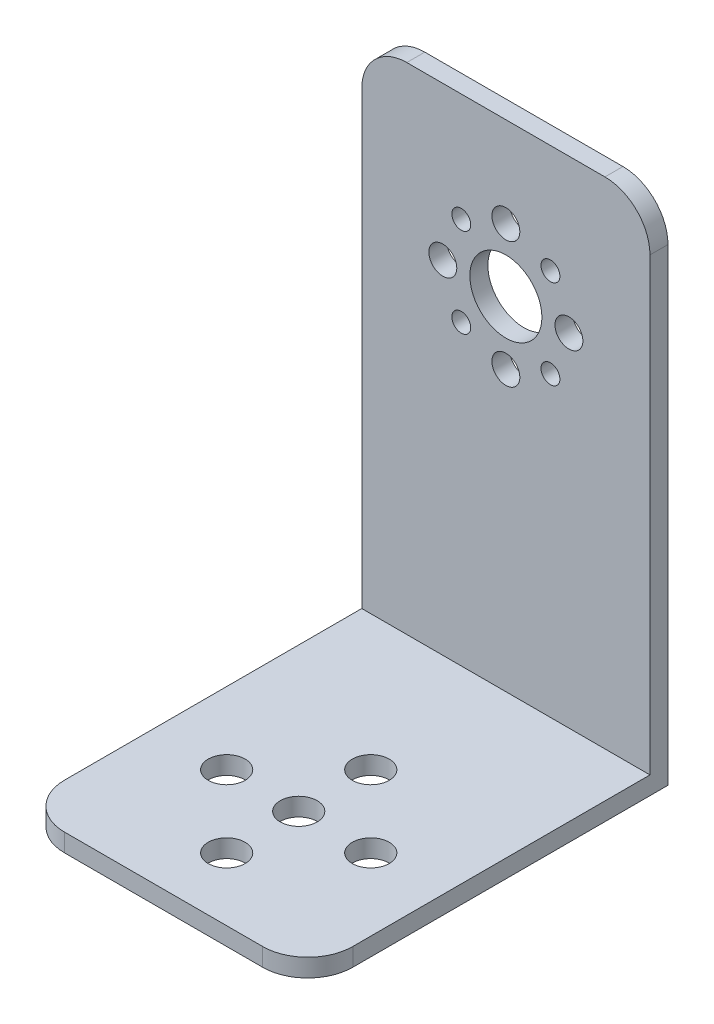
ISO-10303-21;
HEADER;
FILE_DESCRIPTION(('STEP AP214'),'2;1');
FILE_NAME('part.step','',(''),(''),'','','');
FILE_SCHEMA(('AUTOMOTIVE_DESIGN { 1 0 10303 214 1 1 1 1 }'));
ENDSEC;
DATA;
#1=APPLICATION_CONTEXT('core data for automotive mechanical design processes');
#2=APPLICATION_PROTOCOL_DEFINITION('international standard','automotive_design',2000,#1);
#3=PRODUCT_CONTEXT('',#1,'mechanical');
#4=PRODUCT('Part','Part','',(#3));
#5=PRODUCT_RELATED_PRODUCT_CATEGORY('part','',(#4));
#6=PRODUCT_DEFINITION_FORMATION('','',#4);
#7=PRODUCT_DEFINITION_CONTEXT('part definition',#1,'design');
#8=PRODUCT_DEFINITION('design','',#6,#7);
#9=PRODUCT_DEFINITION_SHAPE('','',#8);
#10=(LENGTH_UNIT() NAMED_UNIT(*) SI_UNIT(.MILLI.,.METRE.));
#11=(NAMED_UNIT(*) PLANE_ANGLE_UNIT() SI_UNIT($,.RADIAN.));
#12=(NAMED_UNIT(*) SI_UNIT($,.STERADIAN.) SOLID_ANGLE_UNIT());
#13=UNCERTAINTY_MEASURE_WITH_UNIT(LENGTH_MEASURE(1.E-05),#10,'distance_accuracy_value','');
#14=(GEOMETRIC_REPRESENTATION_CONTEXT(3) GLOBAL_UNCERTAINTY_ASSIGNED_CONTEXT((#13)) GLOBAL_UNIT_ASSIGNED_CONTEXT((#10,
#11,#12)) REPRESENTATION_CONTEXT('',''));
#15=CARTESIAN_POINT('',(0.,0.,0.));
#16=DIRECTION('',(0.,0.,1.));
#17=DIRECTION('',(1.,0.,0.));
#18=AXIS2_PLACEMENT_3D('',#15,#16,#17);
#19=CARTESIAN_POINT('',(16.,2.,-20.));
#20=DIRECTION('',(-1.,0.,0.));
#21=DIRECTION('',(0.,0.,1.));
#22=AXIS2_PLACEMENT_3D('',#19,#20,#21);
#23=PLANE('',#22);
#24=DIRECTION('',(0.,-1.,0.));
#25=VECTOR('',#24,1.);
#26=CARTESIAN_POINT('',(16.,2.,-20.));
#27=LINE('',#26,#25);
#28=CARTESIAN_POINT('',(16.,52.,-20.));
#29=VERTEX_POINT('',#28);
#30=CARTESIAN_POINT('',(16.,0.,-20.));
#31=VERTEX_POINT('',#30);
#32=EDGE_CURVE('E161',#29,#31,#27,.T.);
#33=ORIENTED_EDGE('',*,*,#32,.F.);
#34=DIRECTION('',(0.,0.,-1.));
#35=VECTOR('',#34,1.);
#36=CARTESIAN_POINT('',(16.,52.,-18.));
#37=LINE('',#36,#35);
#38=CARTESIAN_POINT('',(16.,52.,-18.));
#39=VERTEX_POINT('',#38);
#40=EDGE_CURVE('E128',#29,#39,#37,.F.);
#41=ORIENTED_EDGE('',*,*,#40,.T.);
#42=DIRECTION('',(0.,-1.,0.));
#43=VECTOR('',#42,1.);
#44=CARTESIAN_POINT('',(16.,57.,-18.));
#45=LINE('',#44,#43);
#46=CARTESIAN_POINT('',(16.,2.,-18.));
#47=VERTEX_POINT('',#46);
#48=EDGE_CURVE('E125',#39,#47,#45,.T.);
#49=ORIENTED_EDGE('',*,*,#48,.T.);
#50=DIRECTION('',(0.,0.,-1.));
#51=VECTOR('',#50,1.);
#52=CARTESIAN_POINT('',(16.,2.,-20.));
#53=LINE('',#52,#51);
#54=CARTESIAN_POINT('',(16.,2.,15.));
#55=VERTEX_POINT('',#54);
#56=EDGE_CURVE('E111',#55,#47,#53,.T.);
#57=ORIENTED_EDGE('',*,*,#56,.F.);
#58=DIRECTION('',(0.,-1.,0.));
#59=VECTOR('',#58,1.);
#60=CARTESIAN_POINT('',(16.,2.,15.));
#61=LINE('',#60,#59);
#62=CARTESIAN_POINT('',(16.,0.,15.));
#63=VERTEX_POINT('',#62);
#64=EDGE_CURVE('E174',#55,#63,#61,.T.);
#65=ORIENTED_EDGE('',*,*,#64,.T.);
#66=DIRECTION('',(0.,0.,-1.));
#67=VECTOR('',#66,1.);
#68=CARTESIAN_POINT('',(16.,0.,-20.));
#69=LINE('',#68,#67);
#70=EDGE_CURVE('E146',#63,#31,#69,.T.);
#71=ORIENTED_EDGE('',*,*,#70,.T.);
#72=EDGE_LOOP('',(#33,#41,#49,#57,#65,#71));
#73=FACE_BOUND('',#72,.T.);
#74=ADVANCED_FACE('F35',(#73),#23,.F.);
#75=CARTESIAN_POINT('',(-16.,2.,-20.));
#76=DIRECTION('',(0.,0.,1.));
#77=DIRECTION('',(1.,0.,0.));
#78=AXIS2_PLACEMENT_3D('',#75,#76,#77);
#79=PLANE('',#78);
#80=CARTESIAN_POINT('',(0.,47.,-20.));
#81=DIRECTION('',(0.,0.,1.));
#82=DIRECTION('',(1.,0.,0.));
#83=AXIS2_PLACEMENT_3D('',#80,#81,#82);
#84=CIRCLE('',#83,1.55);
#85=CARTESIAN_POINT('',(1.55,47.,-20.));
#86=VERTEX_POINT('',#85);
#87=EDGE_CURVE('E333',#86,#86,#84,.T.);
#88=ORIENTED_EDGE('',*,*,#87,.T.);
#89=EDGE_LOOP('',(#88));
#90=FACE_BOUND('',#89,.T.);
#91=CARTESIAN_POINT('',(4.94974746830584,44.9497474683058,-20.));
#92=DIRECTION('',(0.,0.,1.));
#93=DIRECTION('',(1.,0.,0.));
#94=AXIS2_PLACEMENT_3D('',#91,#92,#93);
#95=CIRCLE('',#94,1.05);
#96=CARTESIAN_POINT('',(5.99974746830584,44.9497474683058,-20.));
#97=VERTEX_POINT('',#96);
#98=EDGE_CURVE('E330',#97,#97,#95,.T.);
#99=ORIENTED_EDGE('',*,*,#98,.T.);
#100=EDGE_LOOP('',(#99));
#101=FACE_BOUND('',#100,.T.);
#102=CARTESIAN_POINT('',(7.,40.,-20.));
#103=DIRECTION('',(0.,0.,1.));
#104=DIRECTION('',(1.,0.,0.));
#105=AXIS2_PLACEMENT_3D('',#102,#103,#104);
#106=CIRCLE('',#105,1.55);
#107=CARTESIAN_POINT('',(8.55,40.,-20.));
#108=VERTEX_POINT('',#107);
#109=EDGE_CURVE('E321',#108,#108,#106,.T.);
#110=ORIENTED_EDGE('',*,*,#109,.T.);
#111=EDGE_LOOP('',(#110));
#112=FACE_BOUND('',#111,.T.);
#113=CARTESIAN_POINT('',(4.94974746830584,35.0502525316942,-20.));
#114=DIRECTION('',(0.,0.,1.));
#115=DIRECTION('',(1.,0.,0.));
#116=AXIS2_PLACEMENT_3D('',#113,#114,#115);
#117=CIRCLE('',#116,1.05);
#118=CARTESIAN_POINT('',(5.99974746830584,35.0502525316942,-20.));
#119=VERTEX_POINT('',#118);
#120=EDGE_CURVE('E317',#119,#119,#117,.T.);
#121=ORIENTED_EDGE('',*,*,#120,.T.);
#122=EDGE_LOOP('',(#121));
#123=FACE_BOUND('',#122,.T.);
#124=CARTESIAN_POINT('',(0.,33.,-20.));
#125=DIRECTION('',(0.,0.,1.));
#126=DIRECTION('',(1.,0.,0.));
#127=AXIS2_PLACEMENT_3D('',#124,#125,#126);
#128=CIRCLE('',#127,1.55);
#129=CARTESIAN_POINT('',(1.55,33.,-20.));
#130=VERTEX_POINT('',#129);
#131=EDGE_CURVE('E315',#130,#130,#128,.T.);
#132=ORIENTED_EDGE('',*,*,#131,.T.);
#133=EDGE_LOOP('',(#132));
#134=FACE_BOUND('',#133,.T.);
#135=CARTESIAN_POINT('',(-4.94974746830584,35.0502525316942,-20.));
#136=DIRECTION('',(0.,0.,1.));
#137=DIRECTION('',(1.,0.,0.));
#138=AXIS2_PLACEMENT_3D('',#135,#136,#137);
#139=CIRCLE('',#138,1.05);
#140=CARTESIAN_POINT('',(-3.89974746830584,35.0502525316942,-20.));
#141=VERTEX_POINT('',#140);
#142=EDGE_CURVE('E318',#141,#141,#139,.T.);
#143=ORIENTED_EDGE('',*,*,#142,.T.);
#144=EDGE_LOOP('',(#143));
#145=FACE_BOUND('',#144,.T.);
#146=CARTESIAN_POINT('',(-4.94974746830584,44.9497474683058,-20.));
#147=DIRECTION('',(0.,0.,1.));
#148=DIRECTION('',(1.,0.,0.));
#149=AXIS2_PLACEMENT_3D('',#146,#147,#148);
#150=CIRCLE('',#149,1.05);
#151=CARTESIAN_POINT('',(-3.89974746830584,44.9497474683058,-20.));
#152=VERTEX_POINT('',#151);
#153=EDGE_CURVE('E324',#152,#152,#150,.T.);
#154=ORIENTED_EDGE('',*,*,#153,.T.);
#155=EDGE_LOOP('',(#154));
#156=FACE_BOUND('',#155,.T.);
#157=CARTESIAN_POINT('',(-7.,40.,-20.));
#158=DIRECTION('',(0.,0.,1.));
#159=DIRECTION('',(1.,0.,0.));
#160=AXIS2_PLACEMENT_3D('',#157,#158,#159);
#161=CIRCLE('',#160,1.55);
#162=CARTESIAN_POINT('',(-5.45,40.,-20.));
#163=VERTEX_POINT('',#162);
#164=EDGE_CURVE('E401',#163,#163,#161,.T.);
#165=ORIENTED_EDGE('',*,*,#164,.T.);
#166=EDGE_LOOP('',(#165));
#167=FACE_BOUND('',#166,.T.);
#168=CARTESIAN_POINT('',(0.,40.,-20.));
#169=DIRECTION('',(0.,0.,1.));
#170=DIRECTION('',(1.,0.,0.));
#171=AXIS2_PLACEMENT_3D('',#168,#169,#170);
#172=CIRCLE('',#171,4.);
#173=CARTESIAN_POINT('',(4.,40.,-20.));
#174=VERTEX_POINT('',#173);
#175=EDGE_CURVE('E404',#174,#174,#172,.T.);
#176=ORIENTED_EDGE('',*,*,#175,.T.);
#177=EDGE_LOOP('',(#176));
#178=FACE_BOUND('',#177,.T.);
#179=DIRECTION('',(-1.,0.,0.));
#180=VECTOR('',#179,1.);
#181=CARTESIAN_POINT('',(16.,57.,-20.));
#182=LINE('',#181,#180);
#183=CARTESIAN_POINT('',(11.,57.,-20.));
#184=VERTEX_POINT('',#183);
#185=CARTESIAN_POINT('',(-11.,57.,-20.));
#186=VERTEX_POINT('',#185);
#187=EDGE_CURVE('E132',#184,#186,#182,.T.);
#188=ORIENTED_EDGE('',*,*,#187,.F.);
#189=CARTESIAN_POINT('',(11.,52.,-20.));
#190=DIRECTION('',(0.,0.,1.));
#191=DIRECTION('',(1.,0.,0.));
#192=AXIS2_PLACEMENT_3D('',#189,#190,#191);
#193=CIRCLE('',#192,5.);
#194=EDGE_CURVE('E172',#184,#29,#193,.F.);
#195=ORIENTED_EDGE('',*,*,#194,.T.);
#196=ORIENTED_EDGE('',*,*,#32,.T.);
#197=DIRECTION('',(-1.,0.,0.));
#198=VECTOR('',#197,1.);
#199=CARTESIAN_POINT('',(-16.,0.,-20.));
#200=LINE('',#199,#198);
#201=CARTESIAN_POINT('',(-16.,0.,-20.));
#202=VERTEX_POINT('',#201);
#203=EDGE_CURVE('E153',#31,#202,#200,.T.);
#204=ORIENTED_EDGE('',*,*,#203,.T.);
#205=DIRECTION('',(0.,-1.,0.));
#206=VECTOR('',#205,1.);
#207=CARTESIAN_POINT('',(-16.,2.,-20.));
#208=LINE('',#207,#206);
#209=CARTESIAN_POINT('',(-16.,52.,-20.));
#210=VERTEX_POINT('',#209);
#211=EDGE_CURVE('E151',#210,#202,#208,.T.);
#212=ORIENTED_EDGE('',*,*,#211,.F.);
#213=CARTESIAN_POINT('',(-11.,52.,-20.));
#214=DIRECTION('',(0.,0.,1.));
#215=DIRECTION('',(1.,0.,0.));
#216=AXIS2_PLACEMENT_3D('',#213,#214,#215);
#217=CIRCLE('',#216,5.);
#218=EDGE_CURVE('E170',#210,#186,#217,.F.);
#219=ORIENTED_EDGE('',*,*,#218,.T.);
#220=EDGE_LOOP('',(#188,#195,#196,#204,#212,#219));
#221=FACE_BOUND('',#220,.T.);
#222=ADVANCED_FACE('F209',(#90,#101,#112,#123,#134,#145,#156,#167,#178,#221),#79,.F.);
#223=CARTESIAN_POINT('',(-16.,2.,-20.));
#224=DIRECTION('',(1.,0.,0.));
#225=DIRECTION('',(0.,0.,-1.));
#226=AXIS2_PLACEMENT_3D('',#223,#224,#225);
#227=PLANE('',#226);
#228=DIRECTION('',(0.,-1.,0.));
#229=VECTOR('',#228,1.);
#230=CARTESIAN_POINT('',(-16.,57.,-18.));
#231=LINE('',#230,#229);
#232=CARTESIAN_POINT('',(-16.,52.,-18.));
#233=VERTEX_POINT('',#232);
#234=CARTESIAN_POINT('',(-16.,2.,-18.));
#235=VERTEX_POINT('',#234);
#236=EDGE_CURVE('E131',#233,#235,#231,.T.);
#237=ORIENTED_EDGE('',*,*,#236,.F.);
#238=DIRECTION('',(0.,0.,1.));
#239=VECTOR('',#238,1.);
#240=CARTESIAN_POINT('',(-16.,52.,-20.));
#241=LINE('',#240,#239);
#242=EDGE_CURVE('E183',#233,#210,#241,.F.);
#243=ORIENTED_EDGE('',*,*,#242,.T.);
#244=ORIENTED_EDGE('',*,*,#211,.T.);
#245=DIRECTION('',(0.,0.,1.));
#246=VECTOR('',#245,1.);
#247=CARTESIAN_POINT('',(-16.,0.,-20.));
#248=LINE('',#247,#246);
#249=CARTESIAN_POINT('',(-16.,0.,15.));
#250=VERTEX_POINT('',#249);
#251=EDGE_CURVE('E156',#202,#250,#248,.T.);
#252=ORIENTED_EDGE('',*,*,#251,.T.);
#253=DIRECTION('',(0.,-1.,0.));
#254=VECTOR('',#253,1.);
#255=CARTESIAN_POINT('',(-16.,2.,15.));
#256=LINE('',#255,#254);
#257=CARTESIAN_POINT('',(-16.,2.,15.));
#258=VERTEX_POINT('',#257);
#259=EDGE_CURVE('E181',#250,#258,#256,.F.);
#260=ORIENTED_EDGE('',*,*,#259,.T.);
#261=DIRECTION('',(0.,0.,1.));
#262=VECTOR('',#261,1.);
#263=CARTESIAN_POINT('',(-16.,2.,-20.));
#264=LINE('',#263,#262);
#265=EDGE_CURVE('E121',#235,#258,#264,.T.);
#266=ORIENTED_EDGE('',*,*,#265,.F.);
#267=EDGE_LOOP('',(#237,#243,#244,#252,#260,#266));
#268=FACE_BOUND('',#267,.T.);
#269=ADVANCED_FACE('F201',(#268),#227,.F.);
#270=CARTESIAN_POINT('',(-16.,2.,20.));
#271=DIRECTION('',(0.,0.,-1.));
#272=DIRECTION('',(-1.,0.,0.));
#273=AXIS2_PLACEMENT_3D('',#270,#271,#272);
#274=PLANE('',#273);
#275=DIRECTION('',(1.,0.,0.));
#276=VECTOR('',#275,1.);
#277=CARTESIAN_POINT('',(-16.,2.,20.));
#278=LINE('',#277,#276);
#279=CARTESIAN_POINT('',(-11.,2.,20.));
#280=VERTEX_POINT('',#279);
#281=CARTESIAN_POINT('',(11.,2.,20.));
#282=VERTEX_POINT('',#281);
#283=EDGE_CURVE('E149',#280,#282,#278,.T.);
#284=ORIENTED_EDGE('',*,*,#283,.F.);
#285=DIRECTION('',(0.,-1.,0.));
#286=VECTOR('',#285,1.);
#287=CARTESIAN_POINT('',(-11.,2.,20.));
#288=LINE('',#287,#286);
#289=CARTESIAN_POINT('',(-11.,0.,20.));
#290=VERTEX_POINT('',#289);
#291=EDGE_CURVE('E186',#280,#290,#288,.T.);
#292=ORIENTED_EDGE('',*,*,#291,.T.);
#293=DIRECTION('',(1.,0.,0.));
#294=VECTOR('',#293,1.);
#295=CARTESIAN_POINT('',(-16.,0.,20.));
#296=LINE('',#295,#294);
#297=CARTESIAN_POINT('',(11.,0.,20.));
#298=VERTEX_POINT('',#297);
#299=EDGE_CURVE('E122',#290,#298,#296,.T.);
#300=ORIENTED_EDGE('',*,*,#299,.T.);
#301=DIRECTION('',(0.,-1.,0.));
#302=VECTOR('',#301,1.);
#303=CARTESIAN_POINT('',(11.,2.,20.));
#304=LINE('',#303,#302);
#305=EDGE_CURVE('E50',#298,#282,#304,.F.);
#306=ORIENTED_EDGE('',*,*,#305,.T.);
#307=EDGE_LOOP('',(#284,#292,#300,#306));
#308=FACE_BOUND('',#307,.T.);
#309=ADVANCED_FACE('F204',(#308),#274,.F.);
#310=CARTESIAN_POINT('',(0.,2.,0.));
#311=DIRECTION('',(0.,1.,0.));
#312=DIRECTION('',(0.,0.,1.));
#313=AXIS2_PLACEMENT_3D('',#310,#311,#312);
#314=PLANE('',#313);
#315=CARTESIAN_POINT('',(-8.,2.,5.00000000000001));
#316=DIRECTION('',(0.,1.,0.));
#317=DIRECTION('',(0.,0.,1.));
#318=AXIS2_PLACEMENT_3D('',#315,#316,#317);
#319=CIRCLE('',#318,2.05);
#320=CARTESIAN_POINT('',(-8.,2.,7.05000000000001));
#321=VERTEX_POINT('',#320);
#322=EDGE_CURVE('E352',#321,#321,#319,.T.);
#323=ORIENTED_EDGE('',*,*,#322,.F.);
#324=EDGE_LOOP('',(#323));
#325=FACE_BOUND('',#324,.T.);
#326=CARTESIAN_POINT('',(8.,2.,5.00000000000001));
#327=DIRECTION('',(0.,1.,0.));
#328=DIRECTION('',(0.,0.,1.));
#329=AXIS2_PLACEMENT_3D('',#326,#327,#328);
#330=CIRCLE('',#329,2.05);
#331=CARTESIAN_POINT('',(8.,2.,7.05000000000001));
#332=VERTEX_POINT('',#331);
#333=EDGE_CURVE('E340',#332,#332,#330,.T.);
#334=ORIENTED_EDGE('',*,*,#333,.F.);
#335=EDGE_LOOP('',(#334));
#336=FACE_BOUND('',#335,.T.);
#337=CARTESIAN_POINT('',(0.,2.,-2.99999999999999));
#338=DIRECTION('',(0.,1.,0.));
#339=DIRECTION('',(0.,0.,1.));
#340=AXIS2_PLACEMENT_3D('',#337,#338,#339);
#341=CIRCLE('',#340,2.05);
#342=CARTESIAN_POINT('',(0.,2.,-0.949999999999992));
#343=VERTEX_POINT('',#342);
#344=EDGE_CURVE('E341',#343,#343,#341,.T.);
#345=ORIENTED_EDGE('',*,*,#344,.F.);
#346=EDGE_LOOP('',(#345));
#347=FACE_BOUND('',#346,.T.);
#348=CARTESIAN_POINT('',(0.,2.,13.));
#349=DIRECTION('',(0.,1.,0.));
#350=DIRECTION('',(0.,0.,1.));
#351=AXIS2_PLACEMENT_3D('',#348,#349,#350);
#352=CIRCLE('',#351,2.05);
#353=CARTESIAN_POINT('',(0.,2.,15.05));
#354=VERTEX_POINT('',#353);
#355=EDGE_CURVE('E336',#354,#354,#352,.T.);
#356=ORIENTED_EDGE('',*,*,#355,.F.);
#357=EDGE_LOOP('',(#356));
#358=FACE_BOUND('',#357,.T.);
#359=CARTESIAN_POINT('',(0.,2.,5.00000000000001));
#360=DIRECTION('',(0.,1.,0.));
#361=DIRECTION('',(0.,0.,1.));
#362=AXIS2_PLACEMENT_3D('',#359,#360,#361);
#363=CIRCLE('',#362,2.05);
#364=CARTESIAN_POINT('',(0.,2.,7.05000000000001));
#365=VERTEX_POINT('',#364);
#366=EDGE_CURVE('E142',#365,#365,#363,.T.);
#367=ORIENTED_EDGE('',*,*,#366,.F.);
#368=EDGE_LOOP('',(#367));
#369=FACE_BOUND('',#368,.T.);
#370=ORIENTED_EDGE('',*,*,#265,.T.);
#371=CARTESIAN_POINT('',(-11.,2.,15.));
#372=DIRECTION('',(0.,1.,0.));
#373=DIRECTION('',(0.,0.,1.));
#374=AXIS2_PLACEMENT_3D('',#371,#372,#373);
#375=CIRCLE('',#374,5.);
#376=EDGE_CURVE('E11',#258,#280,#375,.T.);
#377=ORIENTED_EDGE('',*,*,#376,.T.);
#378=ORIENTED_EDGE('',*,*,#283,.T.);
#379=CARTESIAN_POINT('',(11.,2.,15.));
#380=DIRECTION('',(0.,1.,0.));
#381=DIRECTION('',(0.,0.,1.));
#382=AXIS2_PLACEMENT_3D('',#379,#380,#381);
#383=CIRCLE('',#382,5.);
#384=EDGE_CURVE('E43',#282,#55,#383,.T.);
#385=ORIENTED_EDGE('',*,*,#384,.T.);
#386=ORIENTED_EDGE('',*,*,#56,.T.);
#387=DIRECTION('',(1.,0.,0.));
#388=VECTOR('',#387,1.);
#389=CARTESIAN_POINT('',(-16.,2.,-18.));
#390=LINE('',#389,#388);
#391=EDGE_CURVE('E115',#235,#47,#390,.T.);
#392=ORIENTED_EDGE('',*,*,#391,.F.);
#393=EDGE_LOOP('',(#370,#377,#378,#385,#386,#392));
#394=FACE_BOUND('',#393,.T.);
#395=ADVANCED_FACE('F113',(#325,#336,#347,#358,#369,#394),#314,.T.);
#396=CARTESIAN_POINT('',(0.,0.,0.));
#397=DIRECTION('',(0.,1.,0.));
#398=DIRECTION('',(0.,0.,1.));
#399=AXIS2_PLACEMENT_3D('',#396,#397,#398);
#400=PLANE('',#399);
#401=CARTESIAN_POINT('',(-8.,0.,5.00000000000001));
#402=DIRECTION('',(0.,1.,0.));
#403=DIRECTION('',(0.,0.,1.));
#404=AXIS2_PLACEMENT_3D('',#401,#402,#403);
#405=CIRCLE('',#404,2.05);
#406=CARTESIAN_POINT('',(-8.,0.,7.05000000000001));
#407=VERTEX_POINT('',#406);
#408=EDGE_CURVE('E349',#407,#407,#405,.T.);
#409=ORIENTED_EDGE('',*,*,#408,.T.);
#410=EDGE_LOOP('',(#409));
#411=FACE_BOUND('',#410,.T.);
#412=CARTESIAN_POINT('',(8.,0.,5.00000000000001));
#413=DIRECTION('',(0.,1.,0.));
#414=DIRECTION('',(0.,0.,1.));
#415=AXIS2_PLACEMENT_3D('',#412,#413,#414);
#416=CIRCLE('',#415,2.05);
#417=CARTESIAN_POINT('',(8.,0.,7.05000000000001));
#418=VERTEX_POINT('',#417);
#419=EDGE_CURVE('E355',#418,#418,#416,.T.);
#420=ORIENTED_EDGE('',*,*,#419,.T.);
#421=EDGE_LOOP('',(#420));
#422=FACE_BOUND('',#421,.T.);
#423=CARTESIAN_POINT('',(0.,0.,-2.99999999999999));
#424=DIRECTION('',(0.,1.,0.));
#425=DIRECTION('',(0.,0.,1.));
#426=AXIS2_PLACEMENT_3D('',#423,#424,#425);
#427=CIRCLE('',#426,2.05);
#428=CARTESIAN_POINT('',(0.,0.,-0.949999999999992));
#429=VERTEX_POINT('',#428);
#430=EDGE_CURVE('E337',#429,#429,#427,.T.);
#431=ORIENTED_EDGE('',*,*,#430,.T.);
#432=EDGE_LOOP('',(#431));
#433=FACE_BOUND('',#432,.T.);
#434=CARTESIAN_POINT('',(0.,0.,13.));
#435=DIRECTION('',(0.,1.,0.));
#436=DIRECTION('',(0.,0.,1.));
#437=AXIS2_PLACEMENT_3D('',#434,#435,#436);
#438=CIRCLE('',#437,2.05);
#439=CARTESIAN_POINT('',(0.,0.,15.05));
#440=VERTEX_POINT('',#439);
#441=EDGE_CURVE('E344',#440,#440,#438,.T.);
#442=ORIENTED_EDGE('',*,*,#441,.T.);
#443=EDGE_LOOP('',(#442));
#444=FACE_BOUND('',#443,.T.);
#445=CARTESIAN_POINT('',(0.,0.,5.00000000000001));
#446=DIRECTION('',(0.,1.,0.));
#447=DIRECTION('',(0.,0.,1.));
#448=AXIS2_PLACEMENT_3D('',#445,#446,#447);
#449=CIRCLE('',#448,2.05);
#450=CARTESIAN_POINT('',(0.,0.,7.05000000000001));
#451=VERTEX_POINT('',#450);
#452=EDGE_CURVE('E137',#451,#451,#449,.T.);
#453=ORIENTED_EDGE('',*,*,#452,.T.);
#454=EDGE_LOOP('',(#453));
#455=FACE_BOUND('',#454,.T.);
#456=ORIENTED_EDGE('',*,*,#299,.F.);
#457=CARTESIAN_POINT('',(-11.,0.,15.));
#458=DIRECTION('',(0.,1.,0.));
#459=DIRECTION('',(0.,0.,1.));
#460=AXIS2_PLACEMENT_3D('',#457,#458,#459);
#461=CIRCLE('',#460,5.);
#462=EDGE_CURVE('E191',#290,#250,#461,.F.);
#463=ORIENTED_EDGE('',*,*,#462,.T.);
#464=ORIENTED_EDGE('',*,*,#251,.F.);
#465=ORIENTED_EDGE('',*,*,#203,.F.);
#466=ORIENTED_EDGE('',*,*,#70,.F.);
#467=CARTESIAN_POINT('',(11.,0.,15.));
#468=DIRECTION('',(0.,1.,0.));
#469=DIRECTION('',(0.,0.,1.));
#470=AXIS2_PLACEMENT_3D('',#467,#468,#469);
#471=CIRCLE('',#470,5.);
#472=EDGE_CURVE('E189',#63,#298,#471,.F.);
#473=ORIENTED_EDGE('',*,*,#472,.T.);
#474=EDGE_LOOP('',(#456,#463,#464,#465,#466,#473));
#475=FACE_BOUND('',#474,.T.);
#476=ADVANCED_FACE('F195',(#411,#422,#433,#444,#455,#475),#400,.F.);
#477=CARTESIAN_POINT('',(-16.,57.,-18.));
#478=DIRECTION('',(0.,0.,-1.));
#479=DIRECTION('',(-1.,0.,0.));
#480=AXIS2_PLACEMENT_3D('',#477,#478,#479);
#481=PLANE('',#480);
#482=CARTESIAN_POINT('',(0.,47.,-18.));
#483=DIRECTION('',(0.,0.,1.));
#484=DIRECTION('',(1.,0.,0.));
#485=AXIS2_PLACEMENT_3D('',#482,#483,#484);
#486=CIRCLE('',#485,1.55);
#487=CARTESIAN_POINT('',(1.55,47.,-18.));
#488=VERTEX_POINT('',#487);
#489=EDGE_CURVE('E410',#488,#488,#486,.T.);
#490=ORIENTED_EDGE('',*,*,#489,.F.);
#491=EDGE_LOOP('',(#490));
#492=FACE_BOUND('',#491,.T.);
#493=CARTESIAN_POINT('',(4.94974746830584,44.9497474683058,-18.));
#494=DIRECTION('',(0.,0.,1.));
#495=DIRECTION('',(1.,0.,0.));
#496=AXIS2_PLACEMENT_3D('',#493,#494,#495);
#497=CIRCLE('',#496,1.05);
#498=CARTESIAN_POINT('',(5.99974746830584,44.9497474683058,-18.));
#499=VERTEX_POINT('',#498);
#500=EDGE_CURVE('E419',#499,#499,#497,.T.);
#501=ORIENTED_EDGE('',*,*,#500,.F.);
#502=EDGE_LOOP('',(#501));
#503=FACE_BOUND('',#502,.T.);
#504=CARTESIAN_POINT('',(7.,40.,-18.));
#505=DIRECTION('',(0.,0.,1.));
#506=DIRECTION('',(-1.,0.,0.));
#507=AXIS2_PLACEMENT_3D('',#504,#505,#506);
#508=CIRCLE('',#507,1.55);
#509=CARTESIAN_POINT('',(5.44999999999999,40.,-18.));
#510=VERTEX_POINT('',#509);
#511=EDGE_CURVE('E416',#510,#510,#508,.T.);
#512=ORIENTED_EDGE('',*,*,#511,.F.);
#513=EDGE_LOOP('',(#512));
#514=FACE_BOUND('',#513,.T.);
#515=CARTESIAN_POINT('',(4.94974746830584,35.0502525316942,-18.));
#516=DIRECTION('',(0.,0.,1.));
#517=DIRECTION('',(-1.,0.,0.));
#518=AXIS2_PLACEMENT_3D('',#515,#516,#517);
#519=CIRCLE('',#518,1.05);
#520=CARTESIAN_POINT('',(3.89974746830584,35.0502525316942,-18.));
#521=VERTEX_POINT('',#520);
#522=EDGE_CURVE('E413',#521,#521,#519,.T.);
#523=ORIENTED_EDGE('',*,*,#522,.F.);
#524=EDGE_LOOP('',(#523));
#525=FACE_BOUND('',#524,.T.);
#526=CARTESIAN_POINT('',(0.,33.,-18.));
#527=DIRECTION('',(0.,0.,1.));
#528=DIRECTION('',(-1.,0.,0.));
#529=AXIS2_PLACEMENT_3D('',#526,#527,#528);
#530=CIRCLE('',#529,1.55);
#531=CARTESIAN_POINT('',(-1.55,33.,-18.));
#532=VERTEX_POINT('',#531);
#533=EDGE_CURVE('E312',#532,#532,#530,.T.);
#534=ORIENTED_EDGE('',*,*,#533,.F.);
#535=EDGE_LOOP('',(#534));
#536=FACE_BOUND('',#535,.T.);
#537=CARTESIAN_POINT('',(-4.94974746830584,35.0502525316942,-18.));
#538=DIRECTION('',(0.,0.,1.));
#539=DIRECTION('',(1.,0.,0.));
#540=AXIS2_PLACEMENT_3D('',#537,#538,#539);
#541=CIRCLE('',#540,1.05);
#542=CARTESIAN_POINT('',(-3.89974746830584,35.0502525316942,-18.));
#543=VERTEX_POINT('',#542);
#544=EDGE_CURVE('E430',#543,#543,#541,.T.);
#545=ORIENTED_EDGE('',*,*,#544,.F.);
#546=EDGE_LOOP('',(#545));
#547=FACE_BOUND('',#546,.T.);
#548=CARTESIAN_POINT('',(-4.94974746830584,44.9497474683058,-18.));
#549=DIRECTION('',(0.,0.,1.));
#550=DIRECTION('',(-1.,0.,0.));
#551=AXIS2_PLACEMENT_3D('',#548,#549,#550);
#552=CIRCLE('',#551,1.05);
#553=CARTESIAN_POINT('',(-5.99974746830584,44.9497474683058,-18.));
#554=VERTEX_POINT('',#553);
#555=EDGE_CURVE('E427',#554,#554,#552,.T.);
#556=ORIENTED_EDGE('',*,*,#555,.F.);
#557=EDGE_LOOP('',(#556));
#558=FACE_BOUND('',#557,.T.);
#559=CARTESIAN_POINT('',(-7.,40.,-18.));
#560=DIRECTION('',(0.,0.,1.));
#561=DIRECTION('',(1.,0.,0.));
#562=AXIS2_PLACEMENT_3D('',#559,#560,#561);
#563=CIRCLE('',#562,1.55);
#564=CARTESIAN_POINT('',(-5.45,40.,-18.));
#565=VERTEX_POINT('',#564);
#566=EDGE_CURVE('E424',#565,#565,#563,.T.);
#567=ORIENTED_EDGE('',*,*,#566,.F.);
#568=EDGE_LOOP('',(#567));
#569=FACE_BOUND('',#568,.T.);
#570=CARTESIAN_POINT('',(0.,40.,-18.));
#571=DIRECTION('',(0.,0.,1.));
#572=DIRECTION('',(1.,0.,0.));
#573=AXIS2_PLACEMENT_3D('',#570,#571,#572);
#574=CIRCLE('',#573,4.);
#575=CARTESIAN_POINT('',(4.,40.,-18.));
#576=VERTEX_POINT('',#575);
#577=EDGE_CURVE('E406',#576,#576,#574,.T.);
#578=ORIENTED_EDGE('',*,*,#577,.F.);
#579=EDGE_LOOP('',(#578));
#580=FACE_BOUND('',#579,.T.);
#581=ORIENTED_EDGE('',*,*,#48,.F.);
#582=CARTESIAN_POINT('',(11.,52.,-18.));
#583=DIRECTION('',(0.,0.,-1.));
#584=DIRECTION('',(-1.,0.,0.));
#585=AXIS2_PLACEMENT_3D('',#582,#583,#584);
#586=CIRCLE('',#585,5.);
#587=CARTESIAN_POINT('',(11.,57.,-18.));
#588=VERTEX_POINT('',#587);
#589=EDGE_CURVE('E179',#39,#588,#586,.F.);
#590=ORIENTED_EDGE('',*,*,#589,.T.);
#591=DIRECTION('',(1.,0.,0.));
#592=VECTOR('',#591,1.);
#593=CARTESIAN_POINT('',(-16.,57.,-18.));
#594=LINE('',#593,#592);
#595=CARTESIAN_POINT('',(-11.,57.,-18.));
#596=VERTEX_POINT('',#595);
#597=EDGE_CURVE('E136',#596,#588,#594,.T.);
#598=ORIENTED_EDGE('',*,*,#597,.F.);
#599=CARTESIAN_POINT('',(-11.,52.,-18.));
#600=DIRECTION('',(0.,0.,-1.));
#601=DIRECTION('',(-1.,0.,0.));
#602=AXIS2_PLACEMENT_3D('',#599,#600,#601);
#603=CIRCLE('',#602,5.);
#604=EDGE_CURVE('E177',#596,#233,#603,.F.);
#605=ORIENTED_EDGE('',*,*,#604,.T.);
#606=ORIENTED_EDGE('',*,*,#236,.T.);
#607=ORIENTED_EDGE('',*,*,#391,.T.);
#608=EDGE_LOOP('',(#581,#590,#598,#605,#606,#607));
#609=FACE_BOUND('',#608,.T.);
#610=ADVANCED_FACE('F134',(#492,#503,#514,#525,#536,#547,#558,#569,#580,#609),#481,.F.);
#611=CARTESIAN_POINT('',(0.,57.,0.));
#612=DIRECTION('',(0.,1.,0.));
#613=DIRECTION('',(0.,0.,1.));
#614=AXIS2_PLACEMENT_3D('',#611,#612,#613);
#615=PLANE('',#614);
#616=ORIENTED_EDGE('',*,*,#597,.T.);
#617=DIRECTION('',(0.,0.,-1.));
#618=VECTOR('',#617,1.);
#619=CARTESIAN_POINT('',(11.,57.,-20.));
#620=LINE('',#619,#618);
#621=EDGE_CURVE('E167',#588,#184,#620,.T.);
#622=ORIENTED_EDGE('',*,*,#621,.T.);
#623=ORIENTED_EDGE('',*,*,#187,.T.);
#624=DIRECTION('',(0.,0.,1.));
#625=VECTOR('',#624,1.);
#626=CARTESIAN_POINT('',(-11.,57.,-18.));
#627=LINE('',#626,#625);
#628=EDGE_CURVE('E164',#186,#596,#627,.T.);
#629=ORIENTED_EDGE('',*,*,#628,.T.);
#630=EDGE_LOOP('',(#616,#622,#623,#629));
#631=FACE_BOUND('',#630,.T.);
#632=ADVANCED_FACE('F216',(#631),#615,.T.);
#633=CARTESIAN_POINT('',(0.,0.,5.00000000000001));
#634=DIRECTION('',(0.,1.,0.));
#635=DIRECTION('',(0.,0.,1.));
#636=AXIS2_PLACEMENT_3D('',#633,#634,#635);
#637=CYLINDRICAL_SURFACE('',#636,2.05);
#638=ORIENTED_EDGE('',*,*,#452,.F.);
#639=EDGE_LOOP('',(#638));
#640=FACE_BOUND('',#639,.T.);
#641=ORIENTED_EDGE('',*,*,#366,.T.);
#642=EDGE_LOOP('',(#641));
#643=FACE_BOUND('',#642,.T.);
#644=ADVANCED_FACE('F253',(#640,#643),#637,.F.);
#645=CARTESIAN_POINT('',(0.,0.,13.));
#646=DIRECTION('',(0.,1.,0.));
#647=DIRECTION('',(0.,0.,1.));
#648=AXIS2_PLACEMENT_3D('',#645,#646,#647);
#649=CYLINDRICAL_SURFACE('',#648,2.05);
#650=ORIENTED_EDGE('',*,*,#441,.F.);
#651=EDGE_LOOP('',(#650));
#652=FACE_BOUND('',#651,.T.);
#653=ORIENTED_EDGE('',*,*,#355,.T.);
#654=EDGE_LOOP('',(#653));
#655=FACE_BOUND('',#654,.T.);
#656=ADVANCED_FACE('F256',(#652,#655),#649,.F.);
#657=CARTESIAN_POINT('',(0.,0.,-2.99999999999999));
#658=DIRECTION('',(0.,1.,0.));
#659=DIRECTION('',(0.,0.,1.));
#660=AXIS2_PLACEMENT_3D('',#657,#658,#659);
#661=CYLINDRICAL_SURFACE('',#660,2.05);
#662=ORIENTED_EDGE('',*,*,#430,.F.);
#663=EDGE_LOOP('',(#662));
#664=FACE_BOUND('',#663,.T.);
#665=ORIENTED_EDGE('',*,*,#344,.T.);
#666=EDGE_LOOP('',(#665));
#667=FACE_BOUND('',#666,.T.);
#668=ADVANCED_FACE('F261',(#664,#667),#661,.F.);
#669=CARTESIAN_POINT('',(8.,0.,5.00000000000001));
#670=DIRECTION('',(0.,1.,0.));
#671=DIRECTION('',(0.,0.,1.));
#672=AXIS2_PLACEMENT_3D('',#669,#670,#671);
#673=CYLINDRICAL_SURFACE('',#672,2.05);
#674=ORIENTED_EDGE('',*,*,#419,.F.);
#675=EDGE_LOOP('',(#674));
#676=FACE_BOUND('',#675,.T.);
#677=ORIENTED_EDGE('',*,*,#333,.T.);
#678=EDGE_LOOP('',(#677));
#679=FACE_BOUND('',#678,.T.);
#680=ADVANCED_FACE('F258',(#676,#679),#673,.F.);
#681=CARTESIAN_POINT('',(-8.,0.,5.00000000000001));
#682=DIRECTION('',(0.,1.,0.));
#683=DIRECTION('',(0.,0.,1.));
#684=AXIS2_PLACEMENT_3D('',#681,#682,#683);
#685=CYLINDRICAL_SURFACE('',#684,2.05);
#686=ORIENTED_EDGE('',*,*,#408,.F.);
#687=EDGE_LOOP('',(#686));
#688=FACE_BOUND('',#687,.T.);
#689=ORIENTED_EDGE('',*,*,#322,.T.);
#690=EDGE_LOOP('',(#689));
#691=FACE_BOUND('',#690,.T.);
#692=ADVANCED_FACE('F228',(#688,#691),#685,.F.);
#693=CARTESIAN_POINT('',(11.,52.,0.));
#694=DIRECTION('',(0.,0.,1.));
#695=DIRECTION('',(1.,0.,0.));
#696=AXIS2_PLACEMENT_3D('',#693,#694,#695);
#697=CYLINDRICAL_SURFACE('',#696,5.);
#698=ORIENTED_EDGE('',*,*,#589,.F.);
#699=ORIENTED_EDGE('',*,*,#40,.F.);
#700=ORIENTED_EDGE('',*,*,#194,.F.);
#701=ORIENTED_EDGE('',*,*,#621,.F.);
#702=EDGE_LOOP('',(#698,#699,#700,#701));
#703=FACE_BOUND('',#702,.T.);
#704=ADVANCED_FACE('F212',(#703),#697,.T.);
#705=CARTESIAN_POINT('',(-11.,52.,0.));
#706=DIRECTION('',(0.,0.,-1.));
#707=DIRECTION('',(-1.,0.,0.));
#708=AXIS2_PLACEMENT_3D('',#705,#706,#707);
#709=CYLINDRICAL_SURFACE('',#708,5.);
#710=ORIENTED_EDGE('',*,*,#218,.F.);
#711=ORIENTED_EDGE('',*,*,#242,.F.);
#712=ORIENTED_EDGE('',*,*,#604,.F.);
#713=ORIENTED_EDGE('',*,*,#628,.F.);
#714=EDGE_LOOP('',(#710,#711,#712,#713));
#715=FACE_BOUND('',#714,.T.);
#716=ADVANCED_FACE('F220',(#715),#709,.T.);
#717=CARTESIAN_POINT('',(-11.,2.,15.));
#718=DIRECTION('',(0.,-1.,0.));
#719=DIRECTION('',(0.,0.,-1.));
#720=AXIS2_PLACEMENT_3D('',#717,#718,#719);
#721=CYLINDRICAL_SURFACE('',#720,5.);
#722=ORIENTED_EDGE('',*,*,#376,.F.);
#723=ORIENTED_EDGE('',*,*,#259,.F.);
#724=ORIENTED_EDGE('',*,*,#462,.F.);
#725=ORIENTED_EDGE('',*,*,#291,.F.);
#726=EDGE_LOOP('',(#722,#723,#724,#725));
#727=FACE_BOUND('',#726,.T.);
#728=ADVANCED_FACE('F203',(#727),#721,.T.);
#729=CARTESIAN_POINT('',(11.,2.,15.));
#730=DIRECTION('',(0.,-1.,0.));
#731=DIRECTION('',(0.,0.,-1.));
#732=AXIS2_PLACEMENT_3D('',#729,#730,#731);
#733=CYLINDRICAL_SURFACE('',#732,5.);
#734=ORIENTED_EDGE('',*,*,#384,.F.);
#735=ORIENTED_EDGE('',*,*,#305,.F.);
#736=ORIENTED_EDGE('',*,*,#472,.F.);
#737=ORIENTED_EDGE('',*,*,#64,.F.);
#738=EDGE_LOOP('',(#734,#735,#736,#737));
#739=FACE_BOUND('',#738,.T.);
#740=ADVANCED_FACE('F37',(#739),#733,.T.);
#741=CARTESIAN_POINT('',(0.,40.,-28.));
#742=DIRECTION('',(0.,0.,1.));
#743=DIRECTION('',(1.,0.,0.));
#744=AXIS2_PLACEMENT_3D('',#741,#742,#743);
#745=CYLINDRICAL_SURFACE('',#744,4.);
#746=ORIENTED_EDGE('',*,*,#577,.T.);
#747=EDGE_LOOP('',(#746));
#748=FACE_BOUND('',#747,.T.);
#749=ORIENTED_EDGE('',*,*,#175,.F.);
#750=EDGE_LOOP('',(#749));
#751=FACE_BOUND('',#750,.T.);
#752=ADVANCED_FACE('F272',(#748,#751),#745,.F.);
#753=CARTESIAN_POINT('',(-7.,40.,-28.));
#754=DIRECTION('',(0.,0.,1.));
#755=DIRECTION('',(1.,0.,0.));
#756=AXIS2_PLACEMENT_3D('',#753,#754,#755);
#757=CYLINDRICAL_SURFACE('',#756,1.55);
#758=ORIENTED_EDGE('',*,*,#566,.T.);
#759=EDGE_LOOP('',(#758));
#760=FACE_BOUND('',#759,.T.);
#761=ORIENTED_EDGE('',*,*,#164,.F.);
#762=EDGE_LOOP('',(#761));
#763=FACE_BOUND('',#762,.T.);
#764=ADVANCED_FACE('F275',(#760,#763),#757,.F.);
#765=CARTESIAN_POINT('',(-4.94974746830584,44.9497474683058,-28.));
#766=DIRECTION('',(0.,0.,1.));
#767=DIRECTION('',(1.,0.,0.));
#768=AXIS2_PLACEMENT_3D('',#765,#766,#767);
#769=CYLINDRICAL_SURFACE('',#768,1.05);
#770=ORIENTED_EDGE('',*,*,#555,.T.);
#771=EDGE_LOOP('',(#770));
#772=FACE_BOUND('',#771,.T.);
#773=ORIENTED_EDGE('',*,*,#153,.F.);
#774=EDGE_LOOP('',(#773));
#775=FACE_BOUND('',#774,.T.);
#776=ADVANCED_FACE('F296',(#772,#775),#769,.F.);
#777=CARTESIAN_POINT('',(-4.94974746830584,35.0502525316942,-28.));
#778=DIRECTION('',(0.,0.,1.));
#779=DIRECTION('',(1.,0.,0.));
#780=AXIS2_PLACEMENT_3D('',#777,#778,#779);
#781=CYLINDRICAL_SURFACE('',#780,1.05);
#782=ORIENTED_EDGE('',*,*,#544,.T.);
#783=EDGE_LOOP('',(#782));
#784=FACE_BOUND('',#783,.T.);
#785=ORIENTED_EDGE('',*,*,#142,.F.);
#786=EDGE_LOOP('',(#785));
#787=FACE_BOUND('',#786,.T.);
#788=ADVANCED_FACE('F300',(#784,#787),#781,.F.);
#789=CARTESIAN_POINT('',(0.,33.,-28.));
#790=DIRECTION('',(0.,0.,1.));
#791=DIRECTION('',(1.,0.,0.));
#792=AXIS2_PLACEMENT_3D('',#789,#790,#791);
#793=CYLINDRICAL_SURFACE('',#792,1.55);
#794=ORIENTED_EDGE('',*,*,#533,.T.);
#795=EDGE_LOOP('',(#794));
#796=FACE_BOUND('',#795,.T.);
#797=ORIENTED_EDGE('',*,*,#131,.F.);
#798=EDGE_LOOP('',(#797));
#799=FACE_BOUND('',#798,.T.);
#800=ADVANCED_FACE('F281',(#796,#799),#793,.F.);
#801=CARTESIAN_POINT('',(4.94974746830584,35.0502525316942,-28.));
#802=DIRECTION('',(0.,0.,1.));
#803=DIRECTION('',(1.,0.,0.));
#804=AXIS2_PLACEMENT_3D('',#801,#802,#803);
#805=CYLINDRICAL_SURFACE('',#804,1.05);
#806=ORIENTED_EDGE('',*,*,#522,.T.);
#807=EDGE_LOOP('',(#806));
#808=FACE_BOUND('',#807,.T.);
#809=ORIENTED_EDGE('',*,*,#120,.F.);
#810=EDGE_LOOP('',(#809));
#811=FACE_BOUND('',#810,.T.);
#812=ADVANCED_FACE('F277',(#808,#811),#805,.F.);
#813=CARTESIAN_POINT('',(7.,40.,-28.));
#814=DIRECTION('',(0.,0.,1.));
#815=DIRECTION('',(1.,0.,0.));
#816=AXIS2_PLACEMENT_3D('',#813,#814,#815);
#817=CYLINDRICAL_SURFACE('',#816,1.55);
#818=ORIENTED_EDGE('',*,*,#511,.T.);
#819=EDGE_LOOP('',(#818));
#820=FACE_BOUND('',#819,.T.);
#821=ORIENTED_EDGE('',*,*,#109,.F.);
#822=EDGE_LOOP('',(#821));
#823=FACE_BOUND('',#822,.T.);
#824=ADVANCED_FACE('F280',(#820,#823),#817,.F.);
#825=CARTESIAN_POINT('',(4.94974746830584,44.9497474683058,-28.));
#826=DIRECTION('',(0.,0.,1.));
#827=DIRECTION('',(1.,0.,0.));
#828=AXIS2_PLACEMENT_3D('',#825,#826,#827);
#829=CYLINDRICAL_SURFACE('',#828,1.05);
#830=ORIENTED_EDGE('',*,*,#500,.T.);
#831=EDGE_LOOP('',(#830));
#832=FACE_BOUND('',#831,.T.);
#833=ORIENTED_EDGE('',*,*,#98,.F.);
#834=EDGE_LOOP('',(#833));
#835=FACE_BOUND('',#834,.T.);
#836=ADVANCED_FACE('F285',(#832,#835),#829,.F.);
#837=CARTESIAN_POINT('',(0.,47.,-28.));
#838=DIRECTION('',(0.,0.,1.));
#839=DIRECTION('',(1.,0.,0.));
#840=AXIS2_PLACEMENT_3D('',#837,#838,#839);
#841=CYLINDRICAL_SURFACE('',#840,1.55);
#842=ORIENTED_EDGE('',*,*,#489,.T.);
#843=EDGE_LOOP('',(#842));
#844=FACE_BOUND('',#843,.T.);
#845=ORIENTED_EDGE('',*,*,#87,.F.);
#846=EDGE_LOOP('',(#845));
#847=FACE_BOUND('',#846,.T.);
#848=ADVANCED_FACE('F289',(#844,#847),#841,.F.);
#849=CLOSED_SHELL('',(#74,#222,#269,#309,#395,#476,#610,#632,#644,#656,#668,#680,#692,#704,#716,
#728,#740,#752,#764,#776,#788,#800,#812,#824,#836,#848));
#850=MANIFOLD_SOLID_BREP('B2',#849);
#851=ADVANCED_BREP_SHAPE_REPRESENTATION('',(#18,#850),#14);
#852=SHAPE_DEFINITION_REPRESENTATION(#9,#851);
ENDSEC;
END-ISO-10303-21;
